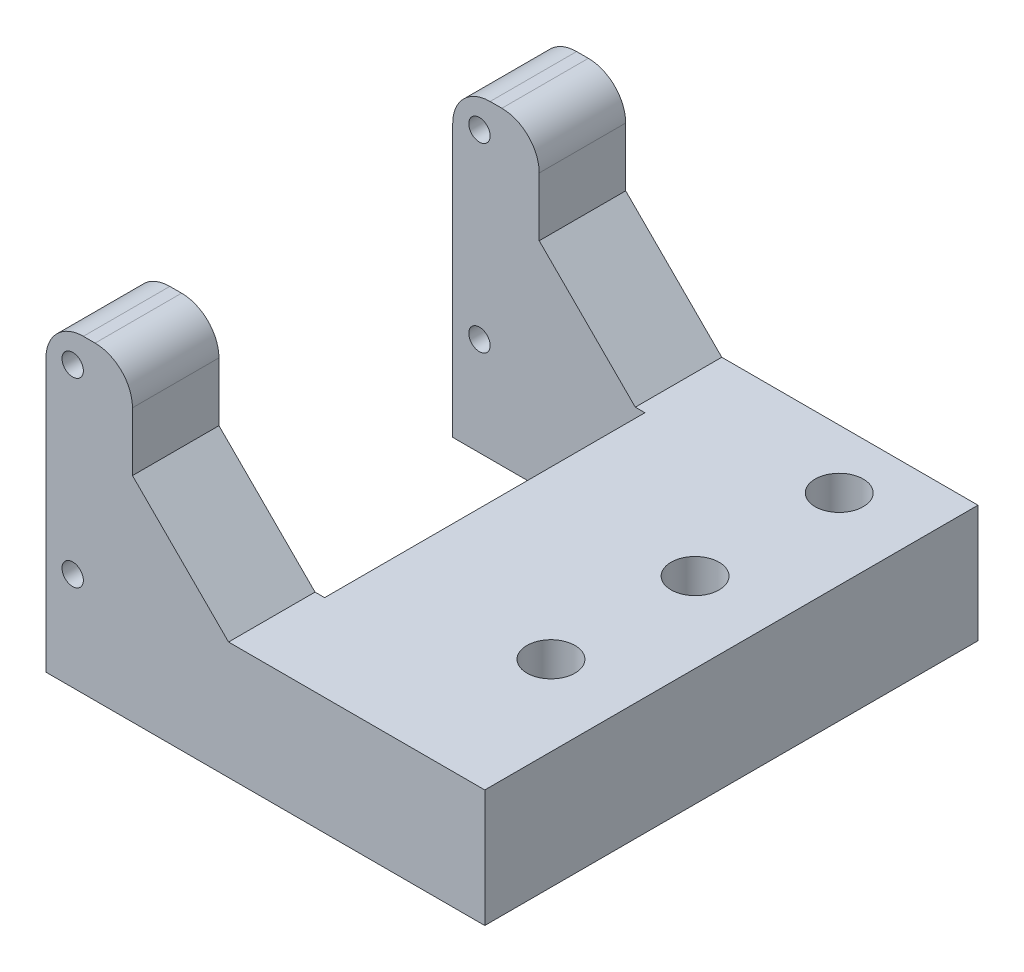
ISO-10303-21;
HEADER;
FILE_DESCRIPTION(('STEP AP214'),'2;1');
FILE_NAME('part.step','',(''),(''),'','','');
FILE_SCHEMA(('AUTOMOTIVE_DESIGN { 1 0 10303 214 1 1 1 1 }'));
ENDSEC;
DATA;
#1=APPLICATION_CONTEXT('core data for automotive mechanical design processes');
#2=APPLICATION_PROTOCOL_DEFINITION('international standard','automotive_design',2000,#1);
#3=PRODUCT_CONTEXT('',#1,'mechanical');
#4=PRODUCT('Part','Part','',(#3));
#5=PRODUCT_RELATED_PRODUCT_CATEGORY('part','',(#4));
#6=PRODUCT_DEFINITION_FORMATION('','',#4);
#7=PRODUCT_DEFINITION_CONTEXT('part definition',#1,'design');
#8=PRODUCT_DEFINITION('design','',#6,#7);
#9=PRODUCT_DEFINITION_SHAPE('','',#8);
#10=(LENGTH_UNIT() NAMED_UNIT(*) SI_UNIT(.MILLI.,.METRE.));
#11=(NAMED_UNIT(*) PLANE_ANGLE_UNIT() SI_UNIT($,.RADIAN.));
#12=(NAMED_UNIT(*) SI_UNIT($,.STERADIAN.) SOLID_ANGLE_UNIT());
#13=UNCERTAINTY_MEASURE_WITH_UNIT(LENGTH_MEASURE(1.E-05),#10,'distance_accuracy_value','');
#14=(GEOMETRIC_REPRESENTATION_CONTEXT(3) GLOBAL_UNCERTAINTY_ASSIGNED_CONTEXT((#13)) GLOBAL_UNIT_ASSIGNED_CONTEXT((#10,
#11,#12)) REPRESENTATION_CONTEXT('',''));
#15=CARTESIAN_POINT('',(0.,0.,0.));
#16=DIRECTION('',(0.,0.,1.));
#17=DIRECTION('',(1.,0.,0.));
#18=AXIS2_PLACEMENT_3D('',#15,#16,#17);
#19=CARTESIAN_POINT('',(0.,29.,46.2));
#20=DIRECTION('',(0.,-1.,0.));
#21=DIRECTION('',(0.,0.,-1.));
#22=AXIS2_PLACEMENT_3D('',#19,#20,#21);
#23=PLANE('',#22);
#24=DIRECTION('',(-1.,0.,0.));
#25=VECTOR('',#24,1.);
#26=CARTESIAN_POINT('',(0.,29.,46.2));
#27=LINE('',#26,#25);
#28=CARTESIAN_POINT('',(4.6,29.,46.2));
#29=VERTEX_POINT('',#28);
#30=CARTESIAN_POINT('',(3.5,29.,46.2));
#31=VERTEX_POINT('',#30);
#32=EDGE_CURVE('E169',#29,#31,#27,.T.);
#33=ORIENTED_EDGE('',*,*,#32,.F.);
#34=DIRECTION('',(0.,0.,-1.));
#35=VECTOR('',#34,1.);
#36=CARTESIAN_POINT('',(4.6,29.,46.2));
#37=LINE('',#36,#35);
#38=CARTESIAN_POINT('',(4.6,29.,38.1));
#39=VERTEX_POINT('',#38);
#40=EDGE_CURVE('E324',#29,#39,#37,.T.);
#41=ORIENTED_EDGE('',*,*,#40,.T.);
#42=DIRECTION('',(1.,0.,0.));
#43=VECTOR('',#42,1.);
#44=CARTESIAN_POINT('',(0.,29.,38.1));
#45=LINE('',#44,#43);
#46=CARTESIAN_POINT('',(3.5,29.,38.1));
#47=VERTEX_POINT('',#46);
#48=EDGE_CURVE('E249',#47,#39,#45,.T.);
#49=ORIENTED_EDGE('',*,*,#48,.F.);
#50=DIRECTION('',(0.,0.,-1.));
#51=VECTOR('',#50,1.);
#52=CARTESIAN_POINT('',(3.5,29.,46.2));
#53=LINE('',#52,#51);
#54=EDGE_CURVE('E278',#47,#31,#53,.F.);
#55=ORIENTED_EDGE('',*,*,#54,.T.);
#56=EDGE_LOOP('',(#33,#41,#49,#55));
#57=FACE_BOUND('',#56,.T.);
#58=ADVANCED_FACE('F33',(#57),#23,.F.);
#59=CARTESIAN_POINT('',(18.,0.,46.2));
#60=DIRECTION('',(-1.,0.,0.));
#61=DIRECTION('',(0.,0.,1.));
#62=AXIS2_PLACEMENT_3D('',#59,#60,#61);
#63=PLANE('',#62);
#64=DIRECTION('',(0.,0.,1.));
#65=VECTOR('',#64,1.);
#66=CARTESIAN_POINT('',(18.,11.,46.2));
#67=LINE('',#66,#65);
#68=CARTESIAN_POINT('',(18.,11.,8.1));
#69=VERTEX_POINT('',#68);
#70=CARTESIAN_POINT('',(18.,11.,38.1));
#71=VERTEX_POINT('',#70);
#72=EDGE_CURVE('E200',#69,#71,#67,.T.);
#73=ORIENTED_EDGE('',*,*,#72,.F.);
#74=DIRECTION('',(0.,1.,0.));
#75=VECTOR('',#74,1.);
#76=CARTESIAN_POINT('',(18.,0.,8.1));
#77=LINE('',#76,#75);
#78=CARTESIAN_POINT('',(18.,0.,8.1));
#79=VERTEX_POINT('',#78);
#80=EDGE_CURVE('E215',#79,#69,#77,.T.);
#81=ORIENTED_EDGE('',*,*,#80,.F.);
#82=DIRECTION('',(0.,0.,1.));
#83=VECTOR('',#82,1.);
#84=CARTESIAN_POINT('',(18.,0.,46.2));
#85=LINE('',#84,#83);
#86=CARTESIAN_POINT('',(18.,0.,38.1));
#87=VERTEX_POINT('',#86);
#88=EDGE_CURVE('E239',#79,#87,#85,.T.);
#89=ORIENTED_EDGE('',*,*,#88,.T.);
#90=DIRECTION('',(0.,1.,0.));
#91=VECTOR('',#90,1.);
#92=CARTESIAN_POINT('',(18.,0.,38.1));
#93=LINE('',#92,#91);
#94=EDGE_CURVE('E259',#87,#71,#93,.T.);
#95=ORIENTED_EDGE('',*,*,#94,.T.);
#96=EDGE_LOOP('',(#73,#81,#89,#95));
#97=FACE_BOUND('',#96,.T.);
#98=ADVANCED_FACE('F348',(#97),#63,.T.);
#99=CARTESIAN_POINT('',(0.,0.,46.2));
#100=DIRECTION('',(1.,0.,0.));
#101=DIRECTION('',(0.,0.,-1.));
#102=AXIS2_PLACEMENT_3D('',#99,#100,#101);
#103=PLANE('',#102);
#104=DIRECTION('',(0.,-1.,0.));
#105=VECTOR('',#104,1.);
#106=CARTESIAN_POINT('',(0.,0.,46.2));
#107=LINE('',#106,#105);
#108=CARTESIAN_POINT('',(0.,25.5,46.2));
#109=VERTEX_POINT('',#108);
#110=CARTESIAN_POINT('',(0.,0.,46.2));
#111=VERTEX_POINT('',#110);
#112=EDGE_CURVE('E164',#109,#111,#107,.T.);
#113=ORIENTED_EDGE('',*,*,#112,.F.);
#114=DIRECTION('',(0.,0.,-1.));
#115=VECTOR('',#114,1.);
#116=CARTESIAN_POINT('',(0.,25.5,46.2));
#117=LINE('',#116,#115);
#118=CARTESIAN_POINT('',(0.,25.5,38.1));
#119=VERTEX_POINT('',#118);
#120=EDGE_CURVE('E263',#109,#119,#117,.T.);
#121=ORIENTED_EDGE('',*,*,#120,.T.);
#122=DIRECTION('',(0.,1.,0.));
#123=VECTOR('',#122,1.);
#124=CARTESIAN_POINT('',(0.,0.,38.1));
#125=LINE('',#124,#123);
#126=CARTESIAN_POINT('',(0.,0.,38.1));
#127=VERTEX_POINT('',#126);
#128=EDGE_CURVE('E260',#127,#119,#125,.T.);
#129=ORIENTED_EDGE('',*,*,#128,.F.);
#130=DIRECTION('',(0.,0.,-1.));
#131=VECTOR('',#130,1.);
#132=CARTESIAN_POINT('',(0.,0.,46.2));
#133=LINE('',#132,#131);
#134=EDGE_CURVE('E242',#111,#127,#133,.T.);
#135=ORIENTED_EDGE('',*,*,#134,.F.);
#136=EDGE_LOOP('',(#113,#121,#129,#135));
#137=FACE_BOUND('',#136,.T.);
#138=ADVANCED_FACE('F342',(#137),#103,.F.);
#139=CARTESIAN_POINT('',(0.,0.,46.2));
#140=DIRECTION('',(0.,1.,0.));
#141=DIRECTION('',(0.,0.,1.));
#142=AXIS2_PLACEMENT_3D('',#139,#140,#141);
#143=PLANE('',#142);
#144=ORIENTED_EDGE('',*,*,#134,.T.);
#145=DIRECTION('',(1.,0.,0.));
#146=VECTOR('',#145,1.);
#147=CARTESIAN_POINT('',(0.,0.,38.1));
#148=LINE('',#147,#146);
#149=EDGE_CURVE('E266',#127,#87,#148,.T.);
#150=ORIENTED_EDGE('',*,*,#149,.T.);
#151=ORIENTED_EDGE('',*,*,#88,.F.);
#152=DIRECTION('',(-1.,0.,0.));
#153=VECTOR('',#152,1.);
#154=CARTESIAN_POINT('',(0.,0.,8.1));
#155=LINE('',#154,#153);
#156=CARTESIAN_POINT('',(0.,0.,8.1));
#157=VERTEX_POINT('',#156);
#158=EDGE_CURVE('E212',#79,#157,#155,.T.);
#159=ORIENTED_EDGE('',*,*,#158,.T.);
#160=DIRECTION('',(0.,0.,-1.));
#161=VECTOR('',#160,1.);
#162=CARTESIAN_POINT('',(0.,0.,46.2));
#163=LINE('',#162,#161);
#164=CARTESIAN_POINT('',(0.,0.,0.));
#165=VERTEX_POINT('',#164);
#166=EDGE_CURVE('E234',#157,#165,#163,.T.);
#167=ORIENTED_EDGE('',*,*,#166,.T.);
#168=DIRECTION('',(-1.,0.,0.));
#169=VECTOR('',#168,1.);
#170=CARTESIAN_POINT('',(18.,0.,0.));
#171=LINE('',#170,#169);
#172=CARTESIAN_POINT('',(41.1,0.,0.));
#173=VERTEX_POINT('',#172);
#174=EDGE_CURVE('E184',#173,#165,#171,.T.);
#175=ORIENTED_EDGE('',*,*,#174,.F.);
#176=DIRECTION('',(0.,0.,-1.));
#177=VECTOR('',#176,1.);
#178=CARTESIAN_POINT('',(41.1,0.,46.2));
#179=LINE('',#178,#177);
#180=CARTESIAN_POINT('',(41.1,0.,46.2));
#181=VERTEX_POINT('',#180);
#182=EDGE_CURVE('E175',#181,#173,#179,.T.);
#183=ORIENTED_EDGE('',*,*,#182,.F.);
#184=DIRECTION('',(1.,0.,0.));
#185=VECTOR('',#184,1.);
#186=CARTESIAN_POINT('',(0.,0.,46.2));
#187=LINE('',#186,#185);
#188=EDGE_CURVE('E157',#111,#181,#187,.T.);
#189=ORIENTED_EDGE('',*,*,#188,.F.);
#190=EDGE_LOOP('',(#144,#150,#151,#159,#167,#175,#183,#189));
#191=FACE_BOUND('',#190,.T.);
#192=CARTESIAN_POINT('',(33.6,0.,19.));
#193=DIRECTION('',(0.,1.,0.));
#194=DIRECTION('',(0.,0.,1.));
#195=AXIS2_PLACEMENT_3D('',#192,#193,#194);
#196=CIRCLE('',#195,2.25);
#197=CARTESIAN_POINT('',(33.6,0.,21.25));
#198=VERTEX_POINT('',#197);
#199=EDGE_CURVE('E665',#198,#198,#196,.T.);
#200=ORIENTED_EDGE('',*,*,#199,.T.);
#201=EDGE_LOOP('',(#200));
#202=FACE_BOUND('',#201,.T.);
#203=CARTESIAN_POINT('',(33.6,0.,32.5));
#204=DIRECTION('',(0.,1.,0.));
#205=DIRECTION('',(0.,0.,1.));
#206=AXIS2_PLACEMENT_3D('',#203,#204,#205);
#207=CIRCLE('',#206,2.25);
#208=CARTESIAN_POINT('',(33.6,0.,34.75));
#209=VERTEX_POINT('',#208);
#210=EDGE_CURVE('E673',#209,#209,#207,.T.);
#211=ORIENTED_EDGE('',*,*,#210,.T.);
#212=EDGE_LOOP('',(#211));
#213=FACE_BOUND('',#212,.T.);
#214=CARTESIAN_POINT('',(33.6,0.,5.5));
#215=DIRECTION('',(0.,1.,0.));
#216=DIRECTION('',(0.,0.,1.));
#217=AXIS2_PLACEMENT_3D('',#214,#215,#216);
#218=CIRCLE('',#217,2.25);
#219=CARTESIAN_POINT('',(33.6,0.,7.75));
#220=VERTEX_POINT('',#219);
#221=EDGE_CURVE('E187',#220,#220,#218,.T.);
#222=ORIENTED_EDGE('',*,*,#221,.T.);
#223=EDGE_LOOP('',(#222));
#224=FACE_BOUND('',#223,.T.);
#225=ADVANCED_FACE('F180',(#191,#202,#213,#224),#143,.F.);
#226=DIRECTION('',(-1.,0.,0.));
#227=VECTOR('',#226,1.);
#228=CARTESIAN_POINT('',(0.,29.,8.1));
#229=LINE('',#228,#227);
#230=CARTESIAN_POINT('',(4.6,29.,8.1));
#231=VERTEX_POINT('',#230);
#232=CARTESIAN_POINT('',(3.5,29.,8.1));
#233=VERTEX_POINT('',#232);
#234=EDGE_CURVE('E211',#231,#233,#229,.T.);
#235=ORIENTED_EDGE('',*,*,#234,.F.);
#236=DIRECTION('',(0.,0.,-1.));
#237=VECTOR('',#236,1.);
#238=CARTESIAN_POINT('',(4.6,29.,46.2));
#239=LINE('',#238,#237);
#240=CARTESIAN_POINT('',(4.6,29.,0.));
#241=VERTEX_POINT('',#240);
#242=EDGE_CURVE('E315',#231,#241,#239,.T.);
#243=ORIENTED_EDGE('',*,*,#242,.T.);
#244=DIRECTION('',(-1.,0.,0.));
#245=VECTOR('',#244,1.);
#246=CARTESIAN_POINT('',(18.,29.,0.));
#247=LINE('',#246,#245);
#248=CARTESIAN_POINT('',(3.5,29.,0.));
#249=VERTEX_POINT('',#248);
#250=EDGE_CURVE('E236',#241,#249,#247,.T.);
#251=ORIENTED_EDGE('',*,*,#250,.T.);
#252=DIRECTION('',(0.,0.,-1.));
#253=VECTOR('',#252,1.);
#254=CARTESIAN_POINT('',(3.5,29.,46.2));
#255=LINE('',#254,#253);
#256=EDGE_CURVE('E275',#249,#233,#255,.F.);
#257=ORIENTED_EDGE('',*,*,#256,.T.);
#258=EDGE_LOOP('',(#235,#243,#251,#257));
#259=FACE_BOUND('',#258,.T.);
#260=ADVANCED_FACE('F383',(#259),#23,.F.);
#261=CARTESIAN_POINT('',(2.5,26.2,0.));
#262=DIRECTION('',(0.,0.,1.));
#263=DIRECTION('',(1.,0.,0.));
#264=AXIS2_PLACEMENT_3D('',#261,#262,#263);
#265=CYLINDRICAL_SURFACE('',#264,1.);
#266=CARTESIAN_POINT('',(2.5,26.2,38.1));
#267=DIRECTION('',(0.,0.,1.));
#268=DIRECTION('',(1.,0.,0.));
#269=AXIS2_PLACEMENT_3D('',#266,#267,#268);
#270=CIRCLE('',#269,1.);
#271=CARTESIAN_POINT('',(3.5,26.2,38.1));
#272=VERTEX_POINT('',#271);
#273=EDGE_CURVE('E254',#272,#272,#270,.F.);
#274=ORIENTED_EDGE('',*,*,#273,.T.);
#275=EDGE_LOOP('',(#274));
#276=FACE_BOUND('',#275,.T.);
#277=CARTESIAN_POINT('',(2.5,26.2,46.2));
#278=DIRECTION('',(0.,0.,1.));
#279=DIRECTION('',(1.,0.,0.));
#280=AXIS2_PLACEMENT_3D('',#277,#278,#279);
#281=CIRCLE('',#280,1.);
#282=CARTESIAN_POINT('',(3.5,26.2,46.2));
#283=VERTEX_POINT('',#282);
#284=EDGE_CURVE('E248',#283,#283,#281,.T.);
#285=ORIENTED_EDGE('',*,*,#284,.T.);
#286=EDGE_LOOP('',(#285));
#287=FACE_BOUND('',#286,.T.);
#288=ADVANCED_FACE('F391',(#276,#287),#265,.F.);
#289=CARTESIAN_POINT('',(2.5,9.2,0.));
#290=DIRECTION('',(0.,0.,1.));
#291=DIRECTION('',(1.,0.,0.));
#292=AXIS2_PLACEMENT_3D('',#289,#290,#291);
#293=CYLINDRICAL_SURFACE('',#292,1.);
#294=CARTESIAN_POINT('',(2.5,9.2,38.1));
#295=DIRECTION('',(0.,0.,1.));
#296=DIRECTION('',(1.,0.,0.));
#297=AXIS2_PLACEMENT_3D('',#294,#295,#296);
#298=CIRCLE('',#297,1.);
#299=CARTESIAN_POINT('',(3.5,9.2,38.1));
#300=VERTEX_POINT('',#299);
#301=EDGE_CURVE('E244',#300,#300,#298,.F.);
#302=ORIENTED_EDGE('',*,*,#301,.T.);
#303=EDGE_LOOP('',(#302));
#304=FACE_BOUND('',#303,.T.);
#305=CARTESIAN_POINT('',(2.5,9.2,46.2));
#306=DIRECTION('',(0.,0.,1.));
#307=DIRECTION('',(1.,0.,0.));
#308=AXIS2_PLACEMENT_3D('',#305,#306,#307);
#309=CIRCLE('',#308,1.);
#310=CARTESIAN_POINT('',(3.5,9.2,46.2));
#311=VERTEX_POINT('',#310);
#312=EDGE_CURVE('E247',#311,#311,#309,.T.);
#313=ORIENTED_EDGE('',*,*,#312,.T.);
#314=EDGE_LOOP('',(#313));
#315=FACE_BOUND('',#314,.T.);
#316=ADVANCED_FACE('F397',(#304,#315),#293,.F.);
#317=CARTESIAN_POINT('',(0.,0.,46.2));
#318=DIRECTION('',(0.,0.,-1.));
#319=DIRECTION('',(-1.,0.,0.));
#320=AXIS2_PLACEMENT_3D('',#317,#318,#319);
#321=PLANE('',#320);
#322=ORIENTED_EDGE('',*,*,#312,.F.);
#323=EDGE_LOOP('',(#322));
#324=FACE_BOUND('',#323,.T.);
#325=ORIENTED_EDGE('',*,*,#284,.F.);
#326=EDGE_LOOP('',(#325));
#327=FACE_BOUND('',#326,.T.);
#328=DIRECTION('',(0.,1.,0.));
#329=VECTOR('',#328,1.);
#330=CARTESIAN_POINT('',(8.1,29.,46.2));
#331=LINE('',#330,#329);
#332=CARTESIAN_POINT('',(8.1,20.0000000000001,46.2));
#333=VERTEX_POINT('',#332);
#334=CARTESIAN_POINT('',(8.1,25.5,46.2));
#335=VERTEX_POINT('',#334);
#336=EDGE_CURVE('E197',#333,#335,#331,.T.);
#337=ORIENTED_EDGE('',*,*,#336,.T.);
#338=CARTESIAN_POINT('',(4.6,25.5,46.2));
#339=DIRECTION('',(0.,0.,-1.));
#340=DIRECTION('',(-1.,0.,0.));
#341=AXIS2_PLACEMENT_3D('',#338,#339,#340);
#342=CIRCLE('',#341,3.5);
#343=EDGE_CURVE('E11',#335,#29,#342,.F.);
#344=ORIENTED_EDGE('',*,*,#343,.T.);
#345=ORIENTED_EDGE('',*,*,#32,.T.);
#346=CARTESIAN_POINT('',(3.5,25.5,46.2));
#347=DIRECTION('',(0.,0.,-1.));
#348=DIRECTION('',(-1.,0.,0.));
#349=AXIS2_PLACEMENT_3D('',#346,#347,#348);
#350=CIRCLE('',#349,3.5);
#351=EDGE_CURVE('E281',#31,#109,#350,.F.);
#352=ORIENTED_EDGE('',*,*,#351,.T.);
#353=ORIENTED_EDGE('',*,*,#112,.T.);
#354=ORIENTED_EDGE('',*,*,#188,.T.);
#355=DIRECTION('',(0.,1.,0.));
#356=VECTOR('',#355,1.);
#357=CARTESIAN_POINT('',(41.1,0.,46.2));
#358=LINE('',#357,#356);
#359=CARTESIAN_POINT('',(41.1,11.,46.2));
#360=VERTEX_POINT('',#359);
#361=EDGE_CURVE('E161',#181,#360,#358,.T.);
#362=ORIENTED_EDGE('',*,*,#361,.T.);
#363=DIRECTION('',(-1.,0.,0.));
#364=VECTOR('',#363,1.);
#365=CARTESIAN_POINT('',(26.1,11.,46.2));
#366=LINE('',#365,#364);
#367=CARTESIAN_POINT('',(17.1,11.,46.2));
#368=VERTEX_POINT('',#367);
#369=EDGE_CURVE('E195',#360,#368,#366,.T.);
#370=ORIENTED_EDGE('',*,*,#369,.T.);
#371=DIRECTION('',(0.707106781186544,-0.707106781186551,0.));
#372=VECTOR('',#371,1.);
#373=CARTESIAN_POINT('',(14.0500000000001,14.0499999999999,46.2));
#374=LINE('',#373,#372);
#375=EDGE_CURVE('E309',#368,#333,#374,.F.);
#376=ORIENTED_EDGE('',*,*,#375,.T.);
#377=EDGE_LOOP('',(#337,#344,#345,#352,#353,#354,#362,#370,#376));
#378=FACE_BOUND('',#377,.T.);
#379=ADVANCED_FACE('F159',(#324,#327,#378),#321,.F.);
#380=CARTESIAN_POINT('',(0.,0.,38.1));
#381=DIRECTION('',(0.,0.,1.));
#382=DIRECTION('',(1.,0.,0.));
#383=AXIS2_PLACEMENT_3D('',#380,#381,#382);
#384=PLANE('',#383);
#385=ORIENTED_EDGE('',*,*,#301,.F.);
#386=EDGE_LOOP('',(#385));
#387=FACE_BOUND('',#386,.T.);
#388=ORIENTED_EDGE('',*,*,#48,.T.);
#389=CARTESIAN_POINT('',(4.6,25.5,38.1));
#390=DIRECTION('',(0.,0.,1.));
#391=DIRECTION('',(1.,0.,0.));
#392=AXIS2_PLACEMENT_3D('',#389,#390,#391);
#393=CIRCLE('',#392,3.5);
#394=CARTESIAN_POINT('',(8.1,25.5,38.1));
#395=VERTEX_POINT('',#394);
#396=EDGE_CURVE('E55',#39,#395,#393,.F.);
#397=ORIENTED_EDGE('',*,*,#396,.T.);
#398=DIRECTION('',(0.,-1.,0.));
#399=VECTOR('',#398,1.);
#400=CARTESIAN_POINT('',(8.1,0.,38.1));
#401=LINE('',#400,#399);
#402=CARTESIAN_POINT('',(8.1,20.0000000000001,38.1));
#403=VERTEX_POINT('',#402);
#404=EDGE_CURVE('E209',#395,#403,#401,.T.);
#405=ORIENTED_EDGE('',*,*,#404,.T.);
#406=DIRECTION('',(-0.707106781186544,0.707106781186551,0.));
#407=VECTOR('',#406,1.);
#408=CARTESIAN_POINT('',(14.0500000000001,14.0499999999999,38.1));
#409=LINE('',#408,#407);
#410=CARTESIAN_POINT('',(17.1,11.,38.1));
#411=VERTEX_POINT('',#410);
#412=EDGE_CURVE('E307',#403,#411,#409,.F.);
#413=ORIENTED_EDGE('',*,*,#412,.T.);
#414=DIRECTION('',(1.,0.,0.));
#415=VECTOR('',#414,1.);
#416=CARTESIAN_POINT('',(0.,11.,38.1));
#417=LINE('',#416,#415);
#418=EDGE_CURVE('E207',#411,#71,#417,.T.);
#419=ORIENTED_EDGE('',*,*,#418,.T.);
#420=ORIENTED_EDGE('',*,*,#94,.F.);
#421=ORIENTED_EDGE('',*,*,#149,.F.);
#422=ORIENTED_EDGE('',*,*,#128,.T.);
#423=CARTESIAN_POINT('',(3.5,25.5,38.1));
#424=DIRECTION('',(0.,0.,1.));
#425=DIRECTION('',(1.,0.,0.));
#426=AXIS2_PLACEMENT_3D('',#423,#424,#425);
#427=CIRCLE('',#426,3.5);
#428=EDGE_CURVE('E273',#119,#47,#427,.F.);
#429=ORIENTED_EDGE('',*,*,#428,.T.);
#430=EDGE_LOOP('',(#388,#397,#405,#413,#419,#420,#421,#422,#429));
#431=FACE_BOUND('',#430,.T.);
#432=ORIENTED_EDGE('',*,*,#273,.F.);
#433=EDGE_LOOP('',(#432));
#434=FACE_BOUND('',#433,.T.);
#435=ADVANCED_FACE('F334',(#387,#431,#434),#384,.F.);
#436=CARTESIAN_POINT('',(18.,0.,0.));
#437=DIRECTION('',(0.,0.,-1.));
#438=DIRECTION('',(-1.,0.,0.));
#439=AXIS2_PLACEMENT_3D('',#436,#437,#438);
#440=PLANE('',#439);
#441=ORIENTED_EDGE('',*,*,#250,.F.);
#442=CARTESIAN_POINT('',(4.6,25.5,0.));
#443=DIRECTION('',(0.,0.,-1.));
#444=DIRECTION('',(-1.,0.,0.));
#445=AXIS2_PLACEMENT_3D('',#442,#443,#444);
#446=CIRCLE('',#445,3.5);
#447=CARTESIAN_POINT('',(8.1,25.5,0.));
#448=VERTEX_POINT('',#447);
#449=EDGE_CURVE('E318',#241,#448,#446,.T.);
#450=ORIENTED_EDGE('',*,*,#449,.T.);
#451=DIRECTION('',(0.,1.,0.));
#452=VECTOR('',#451,1.);
#453=CARTESIAN_POINT('',(8.1,29.,0.));
#454=LINE('',#453,#452);
#455=CARTESIAN_POINT('',(8.1,20.0000000000001,0.));
#456=VERTEX_POINT('',#455);
#457=EDGE_CURVE('E198',#456,#448,#454,.T.);
#458=ORIENTED_EDGE('',*,*,#457,.F.);
#459=DIRECTION('',(-0.707106781186544,0.707106781186551,0.));
#460=VECTOR('',#459,1.);
#461=CARTESIAN_POINT('',(8.1,20.0000000000001,0.));
#462=LINE('',#461,#460);
#463=CARTESIAN_POINT('',(17.1,11.,0.));
#464=VERTEX_POINT('',#463);
#465=EDGE_CURVE('E311',#456,#464,#462,.F.);
#466=ORIENTED_EDGE('',*,*,#465,.T.);
#467=DIRECTION('',(-1.,0.,0.));
#468=VECTOR('',#467,1.);
#469=CARTESIAN_POINT('',(26.1,11.,0.));
#470=LINE('',#469,#468);
#471=CARTESIAN_POINT('',(41.1,11.,0.));
#472=VERTEX_POINT('',#471);
#473=EDGE_CURVE('E193',#472,#464,#470,.T.);
#474=ORIENTED_EDGE('',*,*,#473,.F.);
#475=DIRECTION('',(0.,1.,0.));
#476=VECTOR('',#475,1.);
#477=CARTESIAN_POINT('',(41.1,0.,0.));
#478=LINE('',#477,#476);
#479=EDGE_CURVE('E178',#173,#472,#478,.T.);
#480=ORIENTED_EDGE('',*,*,#479,.F.);
#481=ORIENTED_EDGE('',*,*,#174,.T.);
#482=DIRECTION('',(0.,-1.,0.));
#483=VECTOR('',#482,1.);
#484=CARTESIAN_POINT('',(0.,0.,0.));
#485=LINE('',#484,#483);
#486=CARTESIAN_POINT('',(0.,25.5,0.));
#487=VERTEX_POINT('',#486);
#488=EDGE_CURVE('E232',#487,#165,#485,.T.);
#489=ORIENTED_EDGE('',*,*,#488,.F.);
#490=CARTESIAN_POINT('',(3.5,25.5,0.));
#491=DIRECTION('',(0.,0.,-1.));
#492=DIRECTION('',(-1.,0.,0.));
#493=AXIS2_PLACEMENT_3D('',#490,#491,#492);
#494=CIRCLE('',#493,3.5);
#495=EDGE_CURVE('E286',#487,#249,#494,.T.);
#496=ORIENTED_EDGE('',*,*,#495,.T.);
#497=EDGE_LOOP('',(#441,#450,#458,#466,#474,#480,#481,#489,#496));
#498=FACE_BOUND('',#497,.T.);
#499=CARTESIAN_POINT('',(2.5,9.2,0.));
#500=DIRECTION('',(0.,0.,1.));
#501=DIRECTION('',(1.,0.,0.));
#502=AXIS2_PLACEMENT_3D('',#499,#500,#501);
#503=CIRCLE('',#502,1.);
#504=CARTESIAN_POINT('',(3.5,9.2,0.));
#505=VERTEX_POINT('',#504);
#506=EDGE_CURVE('E226',#505,#505,#503,.T.);
#507=ORIENTED_EDGE('',*,*,#506,.T.);
#508=EDGE_LOOP('',(#507));
#509=FACE_BOUND('',#508,.T.);
#510=CARTESIAN_POINT('',(2.5,26.2,0.));
#511=DIRECTION('',(0.,0.,1.));
#512=DIRECTION('',(1.,0.,0.));
#513=AXIS2_PLACEMENT_3D('',#510,#511,#512);
#514=CIRCLE('',#513,1.);
#515=CARTESIAN_POINT('',(3.5,26.2,0.));
#516=VERTEX_POINT('',#515);
#517=EDGE_CURVE('E229',#516,#516,#514,.T.);
#518=ORIENTED_EDGE('',*,*,#517,.T.);
#519=EDGE_LOOP('',(#518));
#520=FACE_BOUND('',#519,.T.);
#521=ADVANCED_FACE('F361',(#498,#509,#520),#440,.T.);
#522=CARTESIAN_POINT('',(0.,0.,46.2));
#523=DIRECTION('',(1.,0.,0.));
#524=DIRECTION('',(0.,0.,-1.));
#525=AXIS2_PLACEMENT_3D('',#522,#523,#524);
#526=PLANE('',#525);
#527=DIRECTION('',(0.,1.,0.));
#528=VECTOR('',#527,1.);
#529=CARTESIAN_POINT('',(0.,0.,8.1));
#530=LINE('',#529,#528);
#531=CARTESIAN_POINT('',(0.,25.5,8.1));
#532=VERTEX_POINT('',#531);
#533=EDGE_CURVE('E217',#157,#532,#530,.T.);
#534=ORIENTED_EDGE('',*,*,#533,.T.);
#535=DIRECTION('',(0.,0.,-1.));
#536=VECTOR('',#535,1.);
#537=CARTESIAN_POINT('',(0.,25.5,46.2));
#538=LINE('',#537,#536);
#539=EDGE_CURVE('E283',#532,#487,#538,.T.);
#540=ORIENTED_EDGE('',*,*,#539,.T.);
#541=ORIENTED_EDGE('',*,*,#488,.T.);
#542=ORIENTED_EDGE('',*,*,#166,.F.);
#543=EDGE_LOOP('',(#534,#540,#541,#542));
#544=FACE_BOUND('',#543,.T.);
#545=ADVANCED_FACE('F356',(#544),#526,.F.);
#546=CARTESIAN_POINT('',(2.5,26.2,0.));
#547=DIRECTION('',(0.,0.,1.));
#548=DIRECTION('',(1.,0.,0.));
#549=AXIS2_PLACEMENT_3D('',#546,#547,#548);
#550=CYLINDRICAL_SURFACE('',#549,1.);
#551=CARTESIAN_POINT('',(2.5,26.2,8.1));
#552=DIRECTION('',(0.,0.,-1.));
#553=DIRECTION('',(-1.,0.,0.));
#554=AXIS2_PLACEMENT_3D('',#551,#552,#553);
#555=CIRCLE('',#554,1.);
#556=CARTESIAN_POINT('',(1.5,26.2,8.1));
#557=VERTEX_POINT('',#556);
#558=EDGE_CURVE('E223',#557,#557,#555,.F.);
#559=ORIENTED_EDGE('',*,*,#558,.T.);
#560=EDGE_LOOP('',(#559));
#561=FACE_BOUND('',#560,.T.);
#562=ORIENTED_EDGE('',*,*,#517,.F.);
#563=EDGE_LOOP('',(#562));
#564=FACE_BOUND('',#563,.T.);
#565=ADVANCED_FACE('F586',(#561,#564),#550,.F.);
#566=CARTESIAN_POINT('',(2.5,9.2,0.));
#567=DIRECTION('',(0.,0.,1.));
#568=DIRECTION('',(1.,0.,0.));
#569=AXIS2_PLACEMENT_3D('',#566,#567,#568);
#570=CYLINDRICAL_SURFACE('',#569,1.);
#571=CARTESIAN_POINT('',(2.5,9.2,8.1));
#572=DIRECTION('',(0.,0.,-1.));
#573=DIRECTION('',(-1.,0.,0.));
#574=AXIS2_PLACEMENT_3D('',#571,#572,#573);
#575=CIRCLE('',#574,1.);
#576=CARTESIAN_POINT('',(1.5,9.2,8.1));
#577=VERTEX_POINT('',#576);
#578=EDGE_CURVE('E220',#577,#577,#575,.F.);
#579=ORIENTED_EDGE('',*,*,#578,.T.);
#580=EDGE_LOOP('',(#579));
#581=FACE_BOUND('',#580,.T.);
#582=ORIENTED_EDGE('',*,*,#506,.F.);
#583=EDGE_LOOP('',(#582));
#584=FACE_BOUND('',#583,.T.);
#585=ADVANCED_FACE('F552',(#581,#584),#570,.F.);
#586=CARTESIAN_POINT('',(0.,0.,8.1));
#587=DIRECTION('',(0.,0.,-1.));
#588=DIRECTION('',(-1.,0.,0.));
#589=AXIS2_PLACEMENT_3D('',#586,#587,#588);
#590=PLANE('',#589);
#591=ORIENTED_EDGE('',*,*,#578,.F.);
#592=EDGE_LOOP('',(#591));
#593=FACE_BOUND('',#592,.T.);
#594=DIRECTION('',(0.,1.,0.));
#595=VECTOR('',#594,1.);
#596=CARTESIAN_POINT('',(8.1,0.,8.1));
#597=LINE('',#596,#595);
#598=CARTESIAN_POINT('',(8.1,20.0000000000001,8.1));
#599=VERTEX_POINT('',#598);
#600=CARTESIAN_POINT('',(8.1,25.5,8.1));
#601=VERTEX_POINT('',#600);
#602=EDGE_CURVE('E294',#599,#601,#597,.T.);
#603=ORIENTED_EDGE('',*,*,#602,.T.);
#604=CARTESIAN_POINT('',(4.6,25.5,8.1));
#605=DIRECTION('',(0.,0.,-1.));
#606=DIRECTION('',(-1.,0.,0.));
#607=AXIS2_PLACEMENT_3D('',#604,#605,#606);
#608=CIRCLE('',#607,3.5);
#609=EDGE_CURVE('E322',#601,#231,#608,.F.);
#610=ORIENTED_EDGE('',*,*,#609,.T.);
#611=ORIENTED_EDGE('',*,*,#234,.T.);
#612=CARTESIAN_POINT('',(3.5,25.5,8.1));
#613=DIRECTION('',(0.,0.,-1.));
#614=DIRECTION('',(-1.,0.,0.));
#615=AXIS2_PLACEMENT_3D('',#612,#613,#614);
#616=CIRCLE('',#615,3.5);
#617=EDGE_CURVE('E289',#233,#532,#616,.F.);
#618=ORIENTED_EDGE('',*,*,#617,.T.);
#619=ORIENTED_EDGE('',*,*,#533,.F.);
#620=ORIENTED_EDGE('',*,*,#158,.F.);
#621=ORIENTED_EDGE('',*,*,#80,.T.);
#622=DIRECTION('',(-1.,0.,0.));
#623=VECTOR('',#622,1.);
#624=CARTESIAN_POINT('',(0.,11.,8.1));
#625=LINE('',#624,#623);
#626=CARTESIAN_POINT('',(17.1,11.,8.1));
#627=VERTEX_POINT('',#626);
#628=EDGE_CURVE('E291',#69,#627,#625,.T.);
#629=ORIENTED_EDGE('',*,*,#628,.T.);
#630=DIRECTION('',(0.707106781186544,-0.707106781186551,0.));
#631=VECTOR('',#630,1.);
#632=CARTESIAN_POINT('',(14.0500000000001,14.0499999999999,8.1));
#633=LINE('',#632,#631);
#634=EDGE_CURVE('E313',#627,#599,#633,.F.);
#635=ORIENTED_EDGE('',*,*,#634,.T.);
#636=EDGE_LOOP('',(#603,#610,#611,#618,#619,#620,#621,#629,#635));
#637=FACE_BOUND('',#636,.T.);
#638=ORIENTED_EDGE('',*,*,#558,.F.);
#639=EDGE_LOOP('',(#638));
#640=FACE_BOUND('',#639,.T.);
#641=ADVANCED_FACE('F351',(#593,#637,#640),#590,.F.);
#642=CARTESIAN_POINT('',(3.5,25.5,46.2));
#643=DIRECTION('',(0.,0.,-1.));
#644=DIRECTION('',(-1.,0.,0.));
#645=AXIS2_PLACEMENT_3D('',#642,#643,#644);
#646=CYLINDRICAL_SURFACE('',#645,3.5);
#647=ORIENTED_EDGE('',*,*,#351,.F.);
#648=ORIENTED_EDGE('',*,*,#54,.F.);
#649=ORIENTED_EDGE('',*,*,#428,.F.);
#650=ORIENTED_EDGE('',*,*,#120,.F.);
#651=EDGE_LOOP('',(#647,#648,#649,#650));
#652=FACE_BOUND('',#651,.T.);
#653=ADVANCED_FACE('F340',(#652),#646,.T.);
#654=CARTESIAN_POINT('',(3.5,25.5,46.2));
#655=DIRECTION('',(0.,0.,-1.));
#656=DIRECTION('',(-1.,0.,0.));
#657=AXIS2_PLACEMENT_3D('',#654,#655,#656);
#658=CYLINDRICAL_SURFACE('',#657,3.5);
#659=ORIENTED_EDGE('',*,*,#617,.F.);
#660=ORIENTED_EDGE('',*,*,#256,.F.);
#661=ORIENTED_EDGE('',*,*,#495,.F.);
#662=ORIENTED_EDGE('',*,*,#539,.F.);
#663=EDGE_LOOP('',(#659,#660,#661,#662));
#664=FACE_BOUND('',#663,.T.);
#665=ADVANCED_FACE('F420',(#664),#658,.T.);
#666=CARTESIAN_POINT('',(8.1,29.,46.2));
#667=DIRECTION('',(-1.,0.,0.));
#668=DIRECTION('',(0.,-1.,0.));
#669=AXIS2_PLACEMENT_3D('',#666,#667,#668);
#670=PLANE('',#669);
#671=ORIENTED_EDGE('',*,*,#404,.F.);
#672=DIRECTION('',(0.,0.,-1.));
#673=VECTOR('',#672,1.);
#674=CARTESIAN_POINT('',(8.1,25.5,46.2));
#675=LINE('',#674,#673);
#676=EDGE_CURVE('E41',#395,#335,#675,.F.);
#677=ORIENTED_EDGE('',*,*,#676,.T.);
#678=ORIENTED_EDGE('',*,*,#336,.F.);
#679=DIRECTION('',(0.,0.,-1.));
#680=VECTOR('',#679,1.);
#681=CARTESIAN_POINT('',(8.1,20.0000000000001,38.1));
#682=LINE('',#681,#680);
#683=EDGE_CURVE('E297',#333,#403,#682,.T.);
#684=ORIENTED_EDGE('',*,*,#683,.T.);
#685=EDGE_LOOP('',(#671,#677,#678,#684));
#686=FACE_BOUND('',#685,.T.);
#687=ADVANCED_FACE('F373',(#686),#670,.F.);
#688=ORIENTED_EDGE('',*,*,#457,.T.);
#689=DIRECTION('',(0.,0.,-1.));
#690=VECTOR('',#689,1.);
#691=CARTESIAN_POINT('',(8.1,25.5,46.2));
#692=LINE('',#691,#690);
#693=EDGE_CURVE('E320',#448,#601,#692,.F.);
#694=ORIENTED_EDGE('',*,*,#693,.T.);
#695=ORIENTED_EDGE('',*,*,#602,.F.);
#696=DIRECTION('',(0.,0.,-1.));
#697=VECTOR('',#696,1.);
#698=CARTESIAN_POINT('',(8.1,20.0000000000001,0.));
#699=LINE('',#698,#697);
#700=EDGE_CURVE('E304',#599,#456,#699,.T.);
#701=ORIENTED_EDGE('',*,*,#700,.T.);
#702=EDGE_LOOP('',(#688,#694,#695,#701));
#703=FACE_BOUND('',#702,.T.);
#704=ADVANCED_FACE('F408',(#703),#670,.F.);
#705=CARTESIAN_POINT('',(26.1,11.,46.2));
#706=DIRECTION('',(0.,-1.,0.));
#707=DIRECTION('',(0.,0.,-1.));
#708=AXIS2_PLACEMENT_3D('',#705,#706,#707);
#709=PLANE('',#708);
#710=ORIENTED_EDGE('',*,*,#418,.F.);
#711=DIRECTION('',(0.,0.,1.));
#712=VECTOR('',#711,1.);
#713=CARTESIAN_POINT('',(17.1,11.,46.2));
#714=LINE('',#713,#712);
#715=EDGE_CURVE('E302',#411,#368,#714,.T.);
#716=ORIENTED_EDGE('',*,*,#715,.T.);
#717=ORIENTED_EDGE('',*,*,#369,.F.);
#718=DIRECTION('',(0.,0.,-1.));
#719=VECTOR('',#718,1.);
#720=CARTESIAN_POINT('',(41.1,11.,46.2));
#721=LINE('',#720,#719);
#722=EDGE_CURVE('E177',#360,#472,#721,.T.);
#723=ORIENTED_EDGE('',*,*,#722,.T.);
#724=ORIENTED_EDGE('',*,*,#473,.T.);
#725=DIRECTION('',(0.,0.,1.));
#726=VECTOR('',#725,1.);
#727=CARTESIAN_POINT('',(17.1,11.,8.1));
#728=LINE('',#727,#726);
#729=EDGE_CURVE('E300',#464,#627,#728,.T.);
#730=ORIENTED_EDGE('',*,*,#729,.T.);
#731=ORIENTED_EDGE('',*,*,#628,.F.);
#732=ORIENTED_EDGE('',*,*,#72,.T.);
#733=EDGE_LOOP('',(#710,#716,#717,#723,#724,#730,#731,#732));
#734=FACE_BOUND('',#733,.T.);
#735=CARTESIAN_POINT('',(33.6,11.,19.));
#736=DIRECTION('',(0.,1.,0.));
#737=DIRECTION('',(0.,0.,1.));
#738=AXIS2_PLACEMENT_3D('',#735,#736,#737);
#739=CIRCLE('',#738,2.25);
#740=CARTESIAN_POINT('',(33.6,11.,21.25));
#741=VERTEX_POINT('',#740);
#742=EDGE_CURVE('E668',#741,#741,#739,.T.);
#743=ORIENTED_EDGE('',*,*,#742,.F.);
#744=EDGE_LOOP('',(#743));
#745=FACE_BOUND('',#744,.T.);
#746=CARTESIAN_POINT('',(33.6,11.,32.5));
#747=DIRECTION('',(0.,1.,0.));
#748=DIRECTION('',(0.,0.,1.));
#749=AXIS2_PLACEMENT_3D('',#746,#747,#748);
#750=CIRCLE('',#749,2.25);
#751=CARTESIAN_POINT('',(33.6,11.,34.75));
#752=VERTEX_POINT('',#751);
#753=EDGE_CURVE('E670',#752,#752,#750,.T.);
#754=ORIENTED_EDGE('',*,*,#753,.F.);
#755=EDGE_LOOP('',(#754));
#756=FACE_BOUND('',#755,.T.);
#757=CARTESIAN_POINT('',(33.6,11.,5.5));
#758=DIRECTION('',(0.,1.,0.));
#759=DIRECTION('',(0.,0.,1.));
#760=AXIS2_PLACEMENT_3D('',#757,#758,#759);
#761=CIRCLE('',#760,2.25);
#762=CARTESIAN_POINT('',(33.6,11.,7.75));
#763=VERTEX_POINT('',#762);
#764=EDGE_CURVE('E190',#763,#763,#761,.T.);
#765=ORIENTED_EDGE('',*,*,#764,.F.);
#766=EDGE_LOOP('',(#765));
#767=FACE_BOUND('',#766,.T.);
#768=ADVANCED_FACE('F364',(#734,#745,#756,#767),#709,.F.);
#769=CARTESIAN_POINT('',(41.1,0.,46.2));
#770=DIRECTION('',(1.,0.,0.));
#771=DIRECTION('',(0.,0.,-1.));
#772=AXIS2_PLACEMENT_3D('',#769,#770,#771);
#773=PLANE('',#772);
#774=ORIENTED_EDGE('',*,*,#722,.F.);
#775=ORIENTED_EDGE('',*,*,#361,.F.);
#776=ORIENTED_EDGE('',*,*,#182,.T.);
#777=ORIENTED_EDGE('',*,*,#479,.T.);
#778=EDGE_LOOP('',(#774,#775,#776,#777));
#779=FACE_BOUND('',#778,.T.);
#780=ADVANCED_FACE('F173',(#779),#773,.T.);
#781=CARTESIAN_POINT('',(33.6,0.,5.5));
#782=DIRECTION('',(0.,1.,0.));
#783=DIRECTION('',(0.,0.,1.));
#784=AXIS2_PLACEMENT_3D('',#781,#782,#783);
#785=CYLINDRICAL_SURFACE('',#784,2.25);
#786=ORIENTED_EDGE('',*,*,#221,.F.);
#787=EDGE_LOOP('',(#786));
#788=FACE_BOUND('',#787,.T.);
#789=ORIENTED_EDGE('',*,*,#764,.T.);
#790=EDGE_LOOP('',(#789));
#791=FACE_BOUND('',#790,.T.);
#792=ADVANCED_FACE('F455',(#788,#791),#785,.F.);
#793=CARTESIAN_POINT('',(33.6,0.,32.5));
#794=DIRECTION('',(0.,1.,0.));
#795=DIRECTION('',(0.,0.,1.));
#796=AXIS2_PLACEMENT_3D('',#793,#794,#795);
#797=CYLINDRICAL_SURFACE('',#796,2.25);
#798=ORIENTED_EDGE('',*,*,#210,.F.);
#799=EDGE_LOOP('',(#798));
#800=FACE_BOUND('',#799,.T.);
#801=ORIENTED_EDGE('',*,*,#753,.T.);
#802=EDGE_LOOP('',(#801));
#803=FACE_BOUND('',#802,.T.);
#804=ADVANCED_FACE('F466',(#800,#803),#797,.F.);
#805=CARTESIAN_POINT('',(33.6,0.,19.));
#806=DIRECTION('',(0.,1.,0.));
#807=DIRECTION('',(0.,0.,1.));
#808=AXIS2_PLACEMENT_3D('',#805,#806,#807);
#809=CYLINDRICAL_SURFACE('',#808,2.25);
#810=ORIENTED_EDGE('',*,*,#199,.F.);
#811=EDGE_LOOP('',(#810));
#812=FACE_BOUND('',#811,.T.);
#813=ORIENTED_EDGE('',*,*,#742,.T.);
#814=EDGE_LOOP('',(#813));
#815=FACE_BOUND('',#814,.T.);
#816=ADVANCED_FACE('F417',(#812,#815),#809,.F.);
#817=CARTESIAN_POINT('',(8.1,20.0000000000001,46.2));
#818=DIRECTION('',(0.707106781186551,0.707106781186544,0.));
#819=DIRECTION('',(0.,0.,1.));
#820=AXIS2_PLACEMENT_3D('',#817,#818,#819);
#821=PLANE('',#820);
#822=ORIENTED_EDGE('',*,*,#375,.F.);
#823=ORIENTED_EDGE('',*,*,#715,.F.);
#824=ORIENTED_EDGE('',*,*,#412,.F.);
#825=ORIENTED_EDGE('',*,*,#683,.F.);
#826=EDGE_LOOP('',(#822,#823,#824,#825));
#827=FACE_BOUND('',#826,.T.);
#828=ADVANCED_FACE('F371',(#827),#821,.T.);
#829=CARTESIAN_POINT('',(8.1,20.0000000000001,46.2));
#830=DIRECTION('',(0.707106781186551,0.707106781186544,0.));
#831=DIRECTION('',(0.,0.,1.));
#832=AXIS2_PLACEMENT_3D('',#829,#830,#831);
#833=PLANE('',#832);
#834=ORIENTED_EDGE('',*,*,#634,.F.);
#835=ORIENTED_EDGE('',*,*,#729,.F.);
#836=ORIENTED_EDGE('',*,*,#465,.F.);
#837=ORIENTED_EDGE('',*,*,#700,.F.);
#838=EDGE_LOOP('',(#834,#835,#836,#837));
#839=FACE_BOUND('',#838,.T.);
#840=ADVANCED_FACE('F379',(#839),#833,.T.);
#841=CARTESIAN_POINT('',(4.6,25.5,46.2));
#842=DIRECTION('',(0.,0.,-1.));
#843=DIRECTION('',(-1.,0.,0.));
#844=AXIS2_PLACEMENT_3D('',#841,#842,#843);
#845=CYLINDRICAL_SURFACE('',#844,3.5);
#846=ORIENTED_EDGE('',*,*,#609,.F.);
#847=ORIENTED_EDGE('',*,*,#693,.F.);
#848=ORIENTED_EDGE('',*,*,#449,.F.);
#849=ORIENTED_EDGE('',*,*,#242,.F.);
#850=EDGE_LOOP('',(#846,#847,#848,#849));
#851=FACE_BOUND('',#850,.T.);
#852=ADVANCED_FACE('F375',(#851),#845,.T.);
#853=CARTESIAN_POINT('',(4.6,25.5,46.2));
#854=DIRECTION('',(0.,0.,-1.));
#855=DIRECTION('',(-1.,0.,0.));
#856=AXIS2_PLACEMENT_3D('',#853,#854,#855);
#857=CYLINDRICAL_SURFACE('',#856,3.5);
#858=ORIENTED_EDGE('',*,*,#343,.F.);
#859=ORIENTED_EDGE('',*,*,#676,.F.);
#860=ORIENTED_EDGE('',*,*,#396,.F.);
#861=ORIENTED_EDGE('',*,*,#40,.F.);
#862=EDGE_LOOP('',(#858,#859,#860,#861));
#863=FACE_BOUND('',#862,.T.);
#864=ADVANCED_FACE('F35',(#863),#857,.T.);
#865=CLOSED_SHELL('',(#58,#98,#138,#225,#260,#288,#316,#379,#435,#521,#545,#565,#585,#641,#653,
#665,#687,#704,#768,#780,#792,#804,#816,#828,#840,#852,#864));
#866=MANIFOLD_SOLID_BREP('B2',#865);
#867=ADVANCED_BREP_SHAPE_REPRESENTATION('',(#18,#866),#14);
#868=SHAPE_DEFINITION_REPRESENTATION(#9,#867);
ENDSEC;
END-ISO-10303-21;
